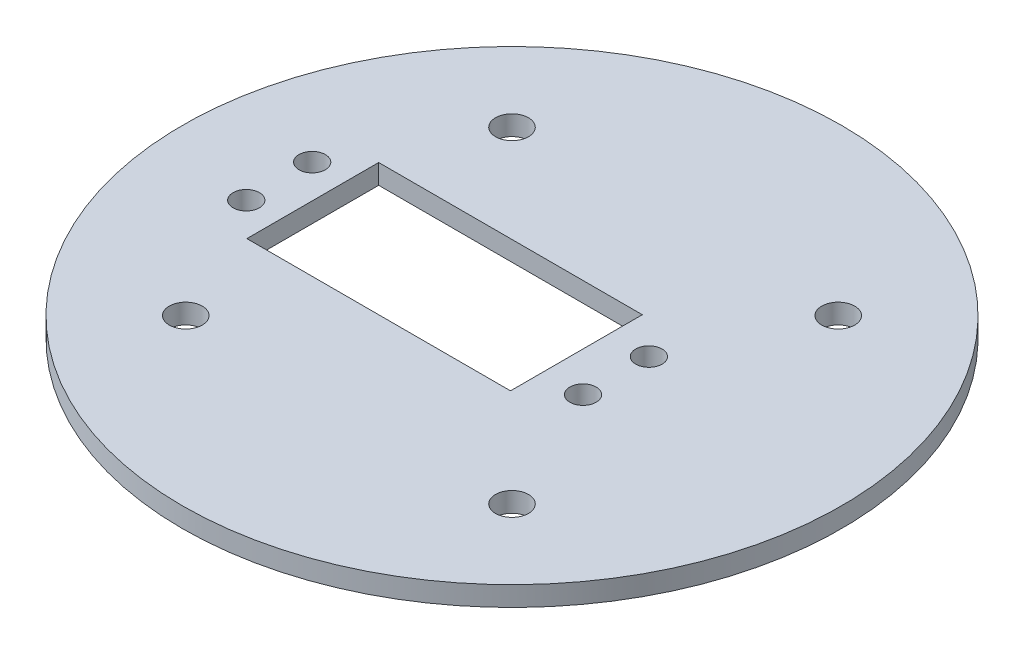
ISO-10303-21;
HEADER;
FILE_DESCRIPTION(('STEP AP214'),'2;1');
FILE_NAME('part.step','',(''),(''),'','','');
FILE_SCHEMA(('AUTOMOTIVE_DESIGN { 1 0 10303 214 1 1 1 1 }'));
ENDSEC;
DATA;
#1=APPLICATION_CONTEXT('core data for automotive mechanical design processes');
#2=APPLICATION_PROTOCOL_DEFINITION('international standard','automotive_design',2000,#1);
#3=PRODUCT_CONTEXT('',#1,'mechanical');
#4=PRODUCT('Part','Part','',(#3));
#5=PRODUCT_RELATED_PRODUCT_CATEGORY('part','',(#4));
#6=PRODUCT_DEFINITION_FORMATION('','',#4);
#7=PRODUCT_DEFINITION_CONTEXT('part definition',#1,'design');
#8=PRODUCT_DEFINITION('design','',#6,#7);
#9=PRODUCT_DEFINITION_SHAPE('','',#8);
#10=(LENGTH_UNIT() NAMED_UNIT(*) SI_UNIT(.MILLI.,.METRE.));
#11=(NAMED_UNIT(*) PLANE_ANGLE_UNIT() SI_UNIT($,.RADIAN.));
#12=(NAMED_UNIT(*) SI_UNIT($,.STERADIAN.) SOLID_ANGLE_UNIT());
#13=UNCERTAINTY_MEASURE_WITH_UNIT(LENGTH_MEASURE(1.E-05),#10,'distance_accuracy_value','');
#14=(GEOMETRIC_REPRESENTATION_CONTEXT(3) GLOBAL_UNCERTAINTY_ASSIGNED_CONTEXT((#13)) GLOBAL_UNIT_ASSIGNED_CONTEXT((#10,
#11,#12)) REPRESENTATION_CONTEXT('',''));
#15=CARTESIAN_POINT('',(0.,0.,0.));
#16=DIRECTION('',(0.,0.,1.));
#17=DIRECTION('',(1.,0.,0.));
#18=AXIS2_PLACEMENT_3D('',#15,#16,#17);
#19=CARTESIAN_POINT('',(0.,3.,0.));
#20=DIRECTION('',(0.,1.,0.));
#21=DIRECTION('',(0.,0.,1.));
#22=AXIS2_PLACEMENT_3D('',#19,#20,#21);
#23=PLANE('',#22);
#24=CARTESIAN_POINT('',(-35.3162358446132,3.,5.));
#25=DIRECTION('',(0.,1.,0.));
#26=DIRECTION('',(0.,0.,1.));
#27=AXIS2_PLACEMENT_3D('',#24,#25,#26);
#28=CIRCLE('',#27,2.);
#29=CARTESIAN_POINT('',(-35.3162358446132,3.,7.));
#30=VERTEX_POINT('',#29);
#31=EDGE_CURVE('E145',#30,#30,#28,.T.);
#32=ORIENTED_EDGE('',*,*,#31,.F.);
#33=EDGE_LOOP('',(#32));
#34=FACE_BOUND('',#33,.T.);
#35=CARTESIAN_POINT('',(15.7720786148711,3.,4.99999999999999));
#36=DIRECTION('',(0.,1.,0.));
#37=DIRECTION('',(0.,0.,-1.));
#38=AXIS2_PLACEMENT_3D('',#35,#36,#37);
#39=CIRCLE('',#38,2.);
#40=CARTESIAN_POINT('',(15.7720786148711,3.,2.99999999999998));
#41=VERTEX_POINT('',#40);
#42=EDGE_CURVE('E149',#41,#41,#39,.T.);
#43=ORIENTED_EDGE('',*,*,#42,.F.);
#44=EDGE_LOOP('',(#43));
#45=FACE_BOUND('',#44,.T.);
#46=CARTESIAN_POINT('',(24.7487373415304,3.,24.7487373415279));
#47=DIRECTION('',(0.,1.,0.));
#48=DIRECTION('',(0.,0.,1.));
#49=AXIS2_PLACEMENT_3D('',#46,#47,#48);
#50=CIRCLE('',#49,2.5);
#51=CARTESIAN_POINT('',(24.7487373415304,3.,27.2487373415279));
#52=VERTEX_POINT('',#51);
#53=EDGE_CURVE('E152',#52,#52,#50,.T.);
#54=ORIENTED_EDGE('',*,*,#53,.F.);
#55=EDGE_LOOP('',(#54));
#56=FACE_BOUND('',#55,.T.);
#57=DIRECTION('',(-1.,0.,0.));
#58=VECTOR('',#57,1.);
#59=CARTESIAN_POINT('',(-9.77207861487105,3.,-10.));
#60=LINE('',#59,#58);
#61=CARTESIAN_POINT('',(9.77207861487105,3.,-10.));
#62=VERTEX_POINT('',#61);
#63=CARTESIAN_POINT('',(-30.2279213851289,3.,-10.));
#64=VERTEX_POINT('',#63);
#65=EDGE_CURVE('E86',#62,#64,#60,.T.);
#66=ORIENTED_EDGE('',*,*,#65,.F.);
#67=DIRECTION('',(0.,0.,-1.));
#68=VECTOR('',#67,1.);
#69=CARTESIAN_POINT('',(9.77207861487105,3.,10.));
#70=LINE('',#69,#68);
#71=CARTESIAN_POINT('',(9.77207861487105,3.,10.));
#72=VERTEX_POINT('',#71);
#73=EDGE_CURVE('E78',#72,#62,#70,.T.);
#74=ORIENTED_EDGE('',*,*,#73,.F.);
#75=DIRECTION('',(1.,0.,0.));
#76=VECTOR('',#75,1.);
#77=CARTESIAN_POINT('',(-9.77207861487105,3.,10.));
#78=LINE('',#77,#76);
#79=CARTESIAN_POINT('',(-30.2279213851289,3.,10.));
#80=VERTEX_POINT('',#79);
#81=EDGE_CURVE('E101',#80,#72,#78,.T.);
#82=ORIENTED_EDGE('',*,*,#81,.F.);
#83=DIRECTION('',(0.,0.,1.));
#84=VECTOR('',#83,1.);
#85=CARTESIAN_POINT('',(-30.2279213851289,3.,10.));
#86=LINE('',#85,#84);
#87=EDGE_CURVE('E99',#64,#80,#86,.T.);
#88=ORIENTED_EDGE('',*,*,#87,.F.);
#89=EDGE_LOOP('',(#66,#74,#82,#88));
#90=FACE_BOUND('',#89,.T.);
#91=CARTESIAN_POINT('',(-24.7487373415292,3.,-24.7487373415291));
#92=DIRECTION('',(0.,1.,0.));
#93=DIRECTION('',(0.,0.,1.));
#94=AXIS2_PLACEMENT_3D('',#91,#92,#93);
#95=CIRCLE('',#94,2.5);
#96=CARTESIAN_POINT('',(-24.7487373415292,3.,-22.2487373415291));
#97=VERTEX_POINT('',#96);
#98=EDGE_CURVE('E117',#97,#97,#95,.T.);
#99=ORIENTED_EDGE('',*,*,#98,.F.);
#100=EDGE_LOOP('',(#99));
#101=FACE_BOUND('',#100,.T.);
#102=CARTESIAN_POINT('',(0.,3.,0.));
#103=DIRECTION('',(0.,1.,0.));
#104=DIRECTION('',(0.,0.,1.));
#105=AXIS2_PLACEMENT_3D('',#102,#103,#104);
#106=CIRCLE('',#105,50.);
#107=CARTESIAN_POINT('',(0.,3.,50.));
#108=VERTEX_POINT('',#107);
#109=EDGE_CURVE('E11',#108,#108,#106,.T.);
#110=ORIENTED_EDGE('',*,*,#109,.T.);
#111=EDGE_LOOP('',(#110));
#112=FACE_BOUND('',#111,.T.);
#113=CARTESIAN_POINT('',(24.7487373415291,3.,-24.7487373415304));
#114=DIRECTION('',(0.,1.,0.));
#115=DIRECTION('',(0.,0.,1.));
#116=AXIS2_PLACEMENT_3D('',#113,#114,#115);
#117=CIRCLE('',#116,2.5);
#118=CARTESIAN_POINT('',(24.7487373415291,3.,-22.2487373415304));
#119=VERTEX_POINT('',#118);
#120=EDGE_CURVE('E107',#119,#119,#117,.T.);
#121=ORIENTED_EDGE('',*,*,#120,.F.);
#122=EDGE_LOOP('',(#121));
#123=FACE_BOUND('',#122,.T.);
#124=CARTESIAN_POINT('',(-24.7487373415279,3.,24.7487373415292));
#125=DIRECTION('',(0.,1.,0.));
#126=DIRECTION('',(0.,0.,1.));
#127=AXIS2_PLACEMENT_3D('',#124,#125,#126);
#128=CIRCLE('',#127,2.5);
#129=CARTESIAN_POINT('',(-24.7487373415279,3.,27.2487373415292));
#130=VERTEX_POINT('',#129);
#131=EDGE_CURVE('E159',#130,#130,#128,.T.);
#132=ORIENTED_EDGE('',*,*,#131,.F.);
#133=EDGE_LOOP('',(#132));
#134=FACE_BOUND('',#133,.T.);
#135=CARTESIAN_POINT('',(15.7720786148711,3.,-4.99999999999999));
#136=DIRECTION('',(0.,1.,0.));
#137=DIRECTION('',(0.,0.,1.));
#138=AXIS2_PLACEMENT_3D('',#135,#136,#137);
#139=CIRCLE('',#138,2.);
#140=CARTESIAN_POINT('',(15.7720786148711,3.,-2.99999999999999));
#141=VERTEX_POINT('',#140);
#142=EDGE_CURVE('E178',#141,#141,#139,.T.);
#143=ORIENTED_EDGE('',*,*,#142,.F.);
#144=EDGE_LOOP('',(#143));
#145=FACE_BOUND('',#144,.T.);
#146=CARTESIAN_POINT('',(-35.3162358446132,3.,-4.99999999999998));
#147=DIRECTION('',(0.,1.,0.));
#148=DIRECTION('',(0.,0.,-1.));
#149=AXIS2_PLACEMENT_3D('',#146,#147,#148);
#150=CIRCLE('',#149,2.);
#151=CARTESIAN_POINT('',(-35.3162358446132,3.,-6.99999999999999));
#152=VERTEX_POINT('',#151);
#153=EDGE_CURVE('E181',#152,#152,#150,.T.);
#154=ORIENTED_EDGE('',*,*,#153,.F.);
#155=EDGE_LOOP('',(#154));
#156=FACE_BOUND('',#155,.T.);
#157=ADVANCED_FACE('F37',(#34,#45,#56,#90,#101,#112,#123,#134,#145,#156),#23,.T.);
#158=CARTESIAN_POINT('',(0.,0.,0.));
#159=DIRECTION('',(0.,1.,0.));
#160=DIRECTION('',(0.,0.,1.));
#161=AXIS2_PLACEMENT_3D('',#158,#159,#160);
#162=PLANE('',#161);
#163=CARTESIAN_POINT('',(-24.7487373415292,0.,-24.7487373415291));
#164=DIRECTION('',(0.,1.,0.));
#165=DIRECTION('',(0.,0.,1.));
#166=AXIS2_PLACEMENT_3D('',#163,#164,#165);
#167=CIRCLE('',#166,2.5);
#168=CARTESIAN_POINT('',(-24.7487373415292,0.,-22.2487373415291));
#169=VERTEX_POINT('',#168);
#170=EDGE_CURVE('E94',#169,#169,#167,.T.);
#171=ORIENTED_EDGE('',*,*,#170,.T.);
#172=EDGE_LOOP('',(#171));
#173=FACE_BOUND('',#172,.T.);
#174=CARTESIAN_POINT('',(0.,0.,0.));
#175=DIRECTION('',(0.,1.,0.));
#176=DIRECTION('',(0.,0.,1.));
#177=AXIS2_PLACEMENT_3D('',#174,#175,#176);
#178=CIRCLE('',#177,50.);
#179=CARTESIAN_POINT('',(0.,0.,50.));
#180=VERTEX_POINT('',#179);
#181=EDGE_CURVE('E41',#180,#180,#178,.T.);
#182=ORIENTED_EDGE('',*,*,#181,.F.);
#183=EDGE_LOOP('',(#182));
#184=FACE_BOUND('',#183,.T.);
#185=DIRECTION('',(0.,0.,-1.));
#186=VECTOR('',#185,1.);
#187=CARTESIAN_POINT('',(9.77207861487105,0.,10.));
#188=LINE('',#187,#186);
#189=CARTESIAN_POINT('',(9.77207861487105,0.,10.));
#190=VERTEX_POINT('',#189);
#191=CARTESIAN_POINT('',(9.77207861487105,0.,-10.));
#192=VERTEX_POINT('',#191);
#193=EDGE_CURVE('E60',#190,#192,#188,.T.);
#194=ORIENTED_EDGE('',*,*,#193,.T.);
#195=DIRECTION('',(-1.,0.,0.));
#196=VECTOR('',#195,1.);
#197=CARTESIAN_POINT('',(-9.77207861487105,0.,-10.));
#198=LINE('',#197,#196);
#199=CARTESIAN_POINT('',(-30.2279213851289,0.,-10.));
#200=VERTEX_POINT('',#199);
#201=EDGE_CURVE('E93',#192,#200,#198,.T.);
#202=ORIENTED_EDGE('',*,*,#201,.T.);
#203=DIRECTION('',(0.,0.,1.));
#204=VECTOR('',#203,1.);
#205=CARTESIAN_POINT('',(-30.2279213851289,0.,10.));
#206=LINE('',#205,#204);
#207=CARTESIAN_POINT('',(-30.2279213851289,0.,10.));
#208=VERTEX_POINT('',#207);
#209=EDGE_CURVE('E109',#200,#208,#206,.T.);
#210=ORIENTED_EDGE('',*,*,#209,.T.);
#211=DIRECTION('',(1.,0.,0.));
#212=VECTOR('',#211,1.);
#213=CARTESIAN_POINT('',(-9.77207861487105,0.,10.));
#214=LINE('',#213,#212);
#215=EDGE_CURVE('E87',#208,#190,#214,.T.);
#216=ORIENTED_EDGE('',*,*,#215,.T.);
#217=EDGE_LOOP('',(#194,#202,#210,#216));
#218=FACE_BOUND('',#217,.T.);
#219=CARTESIAN_POINT('',(24.7487373415291,0.,-24.7487373415304));
#220=DIRECTION('',(0.,1.,0.));
#221=DIRECTION('',(0.,0.,1.));
#222=AXIS2_PLACEMENT_3D('',#219,#220,#221);
#223=CIRCLE('',#222,2.5);
#224=CARTESIAN_POINT('',(24.7487373415291,0.,-22.2487373415304));
#225=VERTEX_POINT('',#224);
#226=EDGE_CURVE('E154',#225,#225,#223,.T.);
#227=ORIENTED_EDGE('',*,*,#226,.T.);
#228=EDGE_LOOP('',(#227));
#229=FACE_BOUND('',#228,.T.);
#230=CARTESIAN_POINT('',(24.7487373415304,0.,24.7487373415279));
#231=DIRECTION('',(0.,1.,0.));
#232=DIRECTION('',(0.,0.,1.));
#233=AXIS2_PLACEMENT_3D('',#230,#231,#232);
#234=CIRCLE('',#233,2.5);
#235=CARTESIAN_POINT('',(24.7487373415304,0.,27.2487373415279));
#236=VERTEX_POINT('',#235);
#237=EDGE_CURVE('E155',#236,#236,#234,.T.);
#238=ORIENTED_EDGE('',*,*,#237,.T.);
#239=EDGE_LOOP('',(#238));
#240=FACE_BOUND('',#239,.T.);
#241=CARTESIAN_POINT('',(-24.7487373415279,0.,24.7487373415292));
#242=DIRECTION('',(0.,1.,0.));
#243=DIRECTION('',(0.,0.,1.));
#244=AXIS2_PLACEMENT_3D('',#241,#242,#243);
#245=CIRCLE('',#244,2.5);
#246=CARTESIAN_POINT('',(-24.7487373415279,0.,27.2487373415292));
#247=VERTEX_POINT('',#246);
#248=EDGE_CURVE('E162',#247,#247,#245,.T.);
#249=ORIENTED_EDGE('',*,*,#248,.T.);
#250=EDGE_LOOP('',(#249));
#251=FACE_BOUND('',#250,.T.);
#252=CARTESIAN_POINT('',(15.7720786148711,0.,4.99999999999999));
#253=DIRECTION('',(0.,1.,0.));
#254=DIRECTION('',(0.,0.,-1.));
#255=AXIS2_PLACEMENT_3D('',#252,#253,#254);
#256=CIRCLE('',#255,2.);
#257=CARTESIAN_POINT('',(15.7720786148711,0.,2.99999999999998));
#258=VERTEX_POINT('',#257);
#259=EDGE_CURVE('E194',#258,#258,#256,.T.);
#260=ORIENTED_EDGE('',*,*,#259,.T.);
#261=EDGE_LOOP('',(#260));
#262=FACE_BOUND('',#261,.T.);
#263=CARTESIAN_POINT('',(15.7720786148711,0.,-4.99999999999999));
#264=DIRECTION('',(0.,1.,0.));
#265=DIRECTION('',(0.,0.,1.));
#266=AXIS2_PLACEMENT_3D('',#263,#264,#265);
#267=CIRCLE('',#266,2.);
#268=CARTESIAN_POINT('',(15.7720786148711,0.,-2.99999999999999));
#269=VERTEX_POINT('',#268);
#270=EDGE_CURVE('E191',#269,#269,#267,.T.);
#271=ORIENTED_EDGE('',*,*,#270,.T.);
#272=EDGE_LOOP('',(#271));
#273=FACE_BOUND('',#272,.T.);
#274=CARTESIAN_POINT('',(-35.3162358446132,0.,5.));
#275=DIRECTION('',(0.,1.,0.));
#276=DIRECTION('',(0.,0.,1.));
#277=AXIS2_PLACEMENT_3D('',#274,#275,#276);
#278=CIRCLE('',#277,2.);
#279=CARTESIAN_POINT('',(-35.3162358446132,0.,7.));
#280=VERTEX_POINT('',#279);
#281=EDGE_CURVE('E183',#280,#280,#278,.T.);
#282=ORIENTED_EDGE('',*,*,#281,.T.);
#283=EDGE_LOOP('',(#282));
#284=FACE_BOUND('',#283,.T.);
#285=CARTESIAN_POINT('',(-35.3162358446132,0.,-4.99999999999998));
#286=DIRECTION('',(0.,1.,0.));
#287=DIRECTION('',(0.,0.,-1.));
#288=AXIS2_PLACEMENT_3D('',#285,#286,#287);
#289=CIRCLE('',#288,2.);
#290=CARTESIAN_POINT('',(-35.3162358446132,0.,-6.99999999999999));
#291=VERTEX_POINT('',#290);
#292=EDGE_CURVE('E184',#291,#291,#289,.T.);
#293=ORIENTED_EDGE('',*,*,#292,.T.);
#294=EDGE_LOOP('',(#293));
#295=FACE_BOUND('',#294,.T.);
#296=ADVANCED_FACE('F123',(#173,#184,#218,#229,#240,#251,#262,#273,#284,#295),#162,.F.);
#297=CARTESIAN_POINT('',(0.,3.,0.));
#298=DIRECTION('',(0.,-1.,0.));
#299=DIRECTION('',(0.,0.,-1.));
#300=AXIS2_PLACEMENT_3D('',#297,#298,#299);
#301=CYLINDRICAL_SURFACE('',#300,50.);
#302=ORIENTED_EDGE('',*,*,#109,.F.);
#303=EDGE_LOOP('',(#302));
#304=FACE_BOUND('',#303,.T.);
#305=ORIENTED_EDGE('',*,*,#181,.T.);
#306=EDGE_LOOP('',(#305));
#307=FACE_BOUND('',#306,.T.);
#308=ADVANCED_FACE('F39',(#304,#307),#301,.T.);
#309=CARTESIAN_POINT('',(-24.7487373415292,3.,-24.7487373415291));
#310=DIRECTION('',(0.,-1.,0.));
#311=DIRECTION('',(0.,0.,-1.));
#312=AXIS2_PLACEMENT_3D('',#309,#310,#311);
#313=CYLINDRICAL_SURFACE('',#312,2.5);
#314=ORIENTED_EDGE('',*,*,#98,.T.);
#315=EDGE_LOOP('',(#314));
#316=FACE_BOUND('',#315,.T.);
#317=ORIENTED_EDGE('',*,*,#170,.F.);
#318=EDGE_LOOP('',(#317));
#319=FACE_BOUND('',#318,.T.);
#320=ADVANCED_FACE('F126',(#316,#319),#313,.F.);
#321=CARTESIAN_POINT('',(9.77207861487105,3.,10.));
#322=DIRECTION('',(-1.,0.,0.));
#323=DIRECTION('',(0.,0.,1.));
#324=AXIS2_PLACEMENT_3D('',#321,#322,#323);
#325=PLANE('',#324);
#326=ORIENTED_EDGE('',*,*,#193,.F.);
#327=DIRECTION('',(0.,-1.,0.));
#328=VECTOR('',#327,1.);
#329=CARTESIAN_POINT('',(9.77207861487105,3.,10.));
#330=LINE('',#329,#328);
#331=EDGE_CURVE('E82',#72,#190,#330,.T.);
#332=ORIENTED_EDGE('',*,*,#331,.F.);
#333=ORIENTED_EDGE('',*,*,#73,.T.);
#334=DIRECTION('',(0.,-1.,0.));
#335=VECTOR('',#334,1.);
#336=CARTESIAN_POINT('',(9.77207861487105,3.,-10.));
#337=LINE('',#336,#335);
#338=EDGE_CURVE('E81',#62,#192,#337,.T.);
#339=ORIENTED_EDGE('',*,*,#338,.T.);
#340=EDGE_LOOP('',(#326,#332,#333,#339));
#341=FACE_BOUND('',#340,.T.);
#342=ADVANCED_FACE('F80',(#341),#325,.T.);
#343=CARTESIAN_POINT('',(-9.77207861487105,3.,-10.));
#344=DIRECTION('',(0.,0.,1.));
#345=DIRECTION('',(1.,0.,0.));
#346=AXIS2_PLACEMENT_3D('',#343,#344,#345);
#347=PLANE('',#346);
#348=ORIENTED_EDGE('',*,*,#201,.F.);
#349=ORIENTED_EDGE('',*,*,#338,.F.);
#350=ORIENTED_EDGE('',*,*,#65,.T.);
#351=DIRECTION('',(0.,-1.,0.));
#352=VECTOR('',#351,1.);
#353=CARTESIAN_POINT('',(-30.2279213851289,3.,-10.));
#354=LINE('',#353,#352);
#355=EDGE_CURVE('E95',#64,#200,#354,.T.);
#356=ORIENTED_EDGE('',*,*,#355,.T.);
#357=EDGE_LOOP('',(#348,#349,#350,#356));
#358=FACE_BOUND('',#357,.T.);
#359=ADVANCED_FACE('F90',(#358),#347,.T.);
#360=CARTESIAN_POINT('',(-30.2279213851289,3.,10.));
#361=DIRECTION('',(1.,0.,0.));
#362=DIRECTION('',(0.,0.,-1.));
#363=AXIS2_PLACEMENT_3D('',#360,#361,#362);
#364=PLANE('',#363);
#365=ORIENTED_EDGE('',*,*,#209,.F.);
#366=ORIENTED_EDGE('',*,*,#355,.F.);
#367=ORIENTED_EDGE('',*,*,#87,.T.);
#368=DIRECTION('',(0.,-1.,0.));
#369=VECTOR('',#368,1.);
#370=CARTESIAN_POINT('',(-30.2279213851289,3.,10.));
#371=LINE('',#370,#369);
#372=EDGE_CURVE('E52',#80,#208,#371,.T.);
#373=ORIENTED_EDGE('',*,*,#372,.T.);
#374=EDGE_LOOP('',(#365,#366,#367,#373));
#375=FACE_BOUND('',#374,.T.);
#376=ADVANCED_FACE('F225',(#375),#364,.T.);
#377=CARTESIAN_POINT('',(-9.77207861487105,3.,10.));
#378=DIRECTION('',(0.,0.,-1.));
#379=DIRECTION('',(-1.,0.,0.));
#380=AXIS2_PLACEMENT_3D('',#377,#378,#379);
#381=PLANE('',#380);
#382=ORIENTED_EDGE('',*,*,#215,.F.);
#383=ORIENTED_EDGE('',*,*,#372,.F.);
#384=ORIENTED_EDGE('',*,*,#81,.T.);
#385=ORIENTED_EDGE('',*,*,#331,.T.);
#386=EDGE_LOOP('',(#382,#383,#384,#385));
#387=FACE_BOUND('',#386,.T.);
#388=ADVANCED_FACE('F222',(#387),#381,.T.);
#389=CARTESIAN_POINT('',(24.7487373415291,3.,-24.7487373415304));
#390=DIRECTION('',(0.,-1.,0.));
#391=DIRECTION('',(0.,0.,-1.));
#392=AXIS2_PLACEMENT_3D('',#389,#390,#391);
#393=CYLINDRICAL_SURFACE('',#392,2.5);
#394=ORIENTED_EDGE('',*,*,#120,.T.);
#395=EDGE_LOOP('',(#394));
#396=FACE_BOUND('',#395,.T.);
#397=ORIENTED_EDGE('',*,*,#226,.F.);
#398=EDGE_LOOP('',(#397));
#399=FACE_BOUND('',#398,.T.);
#400=ADVANCED_FACE('F168',(#396,#399),#393,.F.);
#401=CARTESIAN_POINT('',(24.7487373415304,3.,24.7487373415279));
#402=DIRECTION('',(0.,-1.,0.));
#403=DIRECTION('',(0.,0.,-1.));
#404=AXIS2_PLACEMENT_3D('',#401,#402,#403);
#405=CYLINDRICAL_SURFACE('',#404,2.5);
#406=ORIENTED_EDGE('',*,*,#53,.T.);
#407=EDGE_LOOP('',(#406));
#408=FACE_BOUND('',#407,.T.);
#409=ORIENTED_EDGE('',*,*,#237,.F.);
#410=EDGE_LOOP('',(#409));
#411=FACE_BOUND('',#410,.T.);
#412=ADVANCED_FACE('F208',(#408,#411),#405,.F.);
#413=CARTESIAN_POINT('',(-24.7487373415279,3.,24.7487373415292));
#414=DIRECTION('',(0.,-1.,0.));
#415=DIRECTION('',(0.,0.,-1.));
#416=AXIS2_PLACEMENT_3D('',#413,#414,#415);
#417=CYLINDRICAL_SURFACE('',#416,2.5);
#418=ORIENTED_EDGE('',*,*,#131,.T.);
#419=EDGE_LOOP('',(#418));
#420=FACE_BOUND('',#419,.T.);
#421=ORIENTED_EDGE('',*,*,#248,.F.);
#422=EDGE_LOOP('',(#421));
#423=FACE_BOUND('',#422,.T.);
#424=ADVANCED_FACE('F205',(#420,#423),#417,.F.);
#425=CARTESIAN_POINT('',(15.7720786148711,3.,4.99999999999999));
#426=DIRECTION('',(0.,-1.,0.));
#427=DIRECTION('',(0.,0.,-1.));
#428=AXIS2_PLACEMENT_3D('',#425,#426,#427);
#429=CYLINDRICAL_SURFACE('',#428,2.);
#430=ORIENTED_EDGE('',*,*,#42,.T.);
#431=EDGE_LOOP('',(#430));
#432=FACE_BOUND('',#431,.T.);
#433=ORIENTED_EDGE('',*,*,#259,.F.);
#434=EDGE_LOOP('',(#433));
#435=FACE_BOUND('',#434,.T.);
#436=ADVANCED_FACE('F207',(#432,#435),#429,.F.);
#437=CARTESIAN_POINT('',(15.7720786148711,3.,-4.99999999999999));
#438=DIRECTION('',(0.,-1.,0.));
#439=DIRECTION('',(0.,0.,-1.));
#440=AXIS2_PLACEMENT_3D('',#437,#438,#439);
#441=CYLINDRICAL_SURFACE('',#440,2.);
#442=ORIENTED_EDGE('',*,*,#142,.T.);
#443=EDGE_LOOP('',(#442));
#444=FACE_BOUND('',#443,.T.);
#445=ORIENTED_EDGE('',*,*,#270,.F.);
#446=EDGE_LOOP('',(#445));
#447=FACE_BOUND('',#446,.T.);
#448=ADVANCED_FACE('F214',(#444,#447),#441,.F.);
#449=CARTESIAN_POINT('',(-35.3162358446132,3.,5.));
#450=DIRECTION('',(0.,-1.,0.));
#451=DIRECTION('',(0.,0.,-1.));
#452=AXIS2_PLACEMENT_3D('',#449,#450,#451);
#453=CYLINDRICAL_SURFACE('',#452,2.);
#454=ORIENTED_EDGE('',*,*,#31,.T.);
#455=EDGE_LOOP('',(#454));
#456=FACE_BOUND('',#455,.T.);
#457=ORIENTED_EDGE('',*,*,#281,.F.);
#458=EDGE_LOOP('',(#457));
#459=FACE_BOUND('',#458,.T.);
#460=ADVANCED_FACE('F272',(#456,#459),#453,.F.);
#461=CARTESIAN_POINT('',(-35.3162358446132,3.,-4.99999999999998));
#462=DIRECTION('',(0.,-1.,0.));
#463=DIRECTION('',(0.,0.,-1.));
#464=AXIS2_PLACEMENT_3D('',#461,#462,#463);
#465=CYLINDRICAL_SURFACE('',#464,2.);
#466=ORIENTED_EDGE('',*,*,#153,.T.);
#467=EDGE_LOOP('',(#466));
#468=FACE_BOUND('',#467,.T.);
#469=ORIENTED_EDGE('',*,*,#292,.F.);
#470=EDGE_LOOP('',(#469));
#471=FACE_BOUND('',#470,.T.);
#472=ADVANCED_FACE('F282',(#468,#471),#465,.F.);
#473=CLOSED_SHELL('',(#157,#296,#308,#320,#342,#359,#376,#388,#400,#412,#424,#436,#448,#460,#472));
#474=MANIFOLD_SOLID_BREP('B2',#473);
#475=ADVANCED_BREP_SHAPE_REPRESENTATION('',(#18,#474),#14);
#476=SHAPE_DEFINITION_REPRESENTATION(#9,#475);
ENDSEC;
END-ISO-10303-21;
